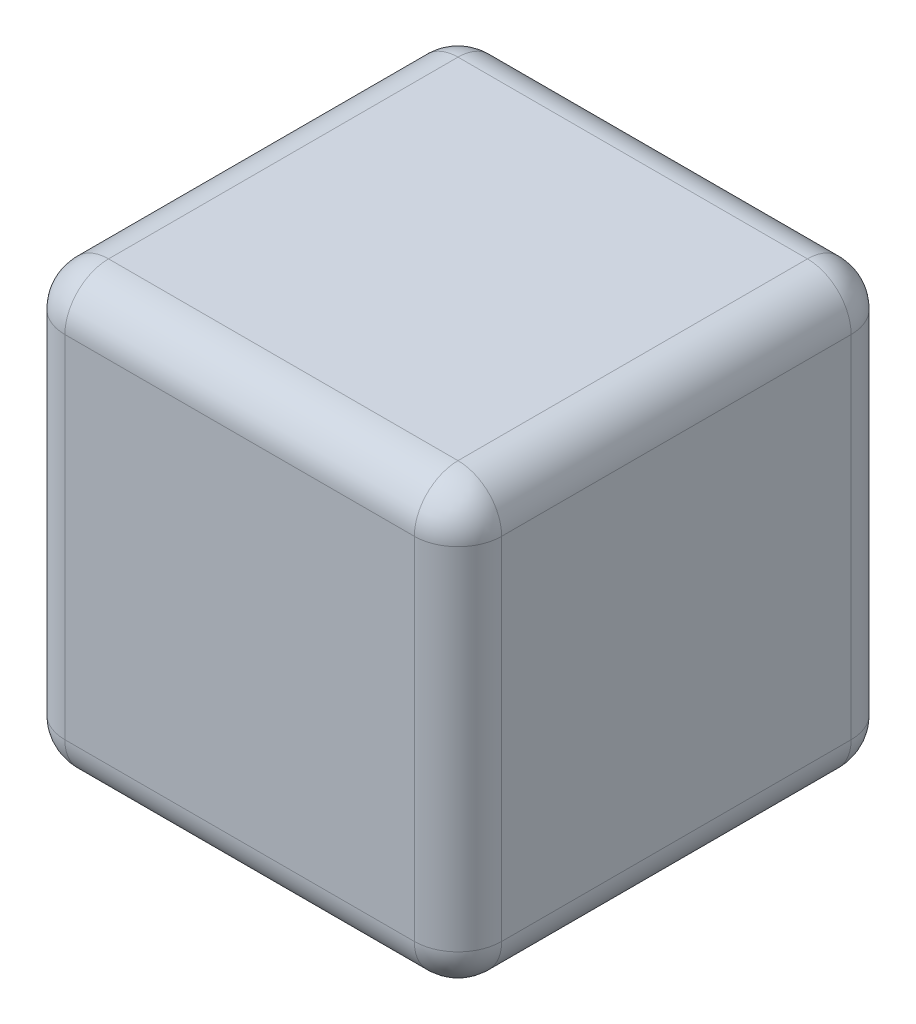
ISO-10303-21;
HEADER;
FILE_DESCRIPTION(('STEP AP214'),'2;1');
FILE_NAME('part.step','',(''),(''),'','','');
FILE_SCHEMA(('AUTOMOTIVE_DESIGN { 1 0 10303 214 1 1 1 1 }'));
ENDSEC;
DATA;
#1=APPLICATION_CONTEXT('core data for automotive mechanical design processes');
#2=APPLICATION_PROTOCOL_DEFINITION('international standard','automotive_design',2000,#1);
#3=PRODUCT_CONTEXT('',#1,'mechanical');
#4=PRODUCT('Part','Part','',(#3));
#5=PRODUCT_RELATED_PRODUCT_CATEGORY('part','',(#4));
#6=PRODUCT_DEFINITION_FORMATION('','',#4);
#7=PRODUCT_DEFINITION_CONTEXT('part definition',#1,'design');
#8=PRODUCT_DEFINITION('design','',#6,#7);
#9=PRODUCT_DEFINITION_SHAPE('','',#8);
#10=(LENGTH_UNIT() NAMED_UNIT(*) SI_UNIT(.MILLI.,.METRE.));
#11=(NAMED_UNIT(*) PLANE_ANGLE_UNIT() SI_UNIT($,.RADIAN.));
#12=(NAMED_UNIT(*) SI_UNIT($,.STERADIAN.) SOLID_ANGLE_UNIT());
#13=UNCERTAINTY_MEASURE_WITH_UNIT(LENGTH_MEASURE(1.E-05),#10,'distance_accuracy_value','');
#14=(GEOMETRIC_REPRESENTATION_CONTEXT(3) GLOBAL_UNCERTAINTY_ASSIGNED_CONTEXT((#13)) GLOBAL_UNIT_ASSIGNED_CONTEXT((#10,
#11,#12)) REPRESENTATION_CONTEXT('',''));
#15=CARTESIAN_POINT('',(0.,0.,0.));
#16=DIRECTION('',(0.,0.,1.));
#17=DIRECTION('',(1.,0.,0.));
#18=AXIS2_PLACEMENT_3D('',#15,#16,#17);
#19=CARTESIAN_POINT('',(0.,20.066,0.));
#20=DIRECTION('',(0.,0.,1.));
#21=DIRECTION('',(1.,0.,0.));
#22=AXIS2_PLACEMENT_3D('',#19,#20,#21);
#23=PLANE('',#22);
#24=DIRECTION('',(0.,-1.,0.));
#25=VECTOR('',#24,1.);
#26=CARTESIAN_POINT('',(-18.,20.066,0.));
#27=LINE('',#26,#25);
#28=CARTESIAN_POINT('',(-18.,18.066,0.));
#29=VERTEX_POINT('',#28);
#30=CARTESIAN_POINT('',(-18.,2.,0.));
#31=VERTEX_POINT('',#30);
#32=EDGE_CURVE('E178',#29,#31,#27,.T.);
#33=ORIENTED_EDGE('',*,*,#32,.T.);
#34=DIRECTION('',(-1.,0.,0.));
#35=VECTOR('',#34,1.);
#36=CARTESIAN_POINT('',(0.,2.,0.));
#37=LINE('',#36,#35);
#38=CARTESIAN_POINT('',(-2.,2.,0.));
#39=VERTEX_POINT('',#38);
#40=EDGE_CURVE('E190',#31,#39,#37,.F.);
#41=ORIENTED_EDGE('',*,*,#40,.T.);
#42=DIRECTION('',(0.,-1.,0.));
#43=VECTOR('',#42,1.);
#44=CARTESIAN_POINT('',(-2.,20.066,0.));
#45=LINE('',#44,#43);
#46=CARTESIAN_POINT('',(-2.,18.066,0.));
#47=VERTEX_POINT('',#46);
#48=EDGE_CURVE('E145',#39,#47,#45,.F.);
#49=ORIENTED_EDGE('',*,*,#48,.T.);
#50=DIRECTION('',(-1.,0.,0.));
#51=VECTOR('',#50,1.);
#52=CARTESIAN_POINT('',(-20.,18.066,0.));
#53=LINE('',#52,#51);
#54=EDGE_CURVE('E174',#47,#29,#53,.T.);
#55=ORIENTED_EDGE('',*,*,#54,.T.);
#56=EDGE_LOOP('',(#33,#41,#49,#55));
#57=FACE_BOUND('',#56,.T.);
#58=ADVANCED_FACE('F44',(#57),#23,.T.);
#59=CARTESIAN_POINT('',(0.,20.066,0.));
#60=DIRECTION('',(-1.,0.,0.));
#61=DIRECTION('',(0.,0.,1.));
#62=AXIS2_PLACEMENT_3D('',#59,#60,#61);
#63=PLANE('',#62);
#64=DIRECTION('',(0.,0.,-1.));
#65=VECTOR('',#64,1.);
#66=CARTESIAN_POINT('',(0.,18.066,0.));
#67=LINE('',#66,#65);
#68=CARTESIAN_POINT('',(0.,18.066,-17.999999878));
#69=VERTEX_POINT('',#68);
#70=CARTESIAN_POINT('',(0.,18.066,-2.));
#71=VERTEX_POINT('',#70);
#72=EDGE_CURVE('E173',#69,#71,#67,.F.);
#73=ORIENTED_EDGE('',*,*,#72,.T.);
#74=DIRECTION('',(0.,-1.,0.));
#75=VECTOR('',#74,1.);
#76=CARTESIAN_POINT('',(0.,0.,-2.));
#77=LINE('',#76,#75);
#78=CARTESIAN_POINT('',(0.,2.,-2.));
#79=VERTEX_POINT('',#78);
#80=EDGE_CURVE('E139',#71,#79,#77,.T.);
#81=ORIENTED_EDGE('',*,*,#80,.T.);
#82=DIRECTION('',(0.,0.,-1.));
#83=VECTOR('',#82,1.);
#84=CARTESIAN_POINT('',(0.,2.,-19.999999878));
#85=LINE('',#84,#83);
#86=CARTESIAN_POINT('',(0.,2.,-17.999999878));
#87=VERTEX_POINT('',#86);
#88=EDGE_CURVE('E158',#79,#87,#85,.T.);
#89=ORIENTED_EDGE('',*,*,#88,.T.);
#90=DIRECTION('',(0.,-1.,0.));
#91=VECTOR('',#90,1.);
#92=CARTESIAN_POINT('',(0.,20.066,-17.999999878));
#93=LINE('',#92,#91);
#94=EDGE_CURVE('E167',#87,#69,#93,.F.);
#95=ORIENTED_EDGE('',*,*,#94,.T.);
#96=EDGE_LOOP('',(#73,#81,#89,#95));
#97=FACE_BOUND('',#96,.T.);
#98=ADVANCED_FACE('F170',(#97),#63,.F.);
#99=CARTESIAN_POINT('',(0.,20.066,-19.999999878));
#100=DIRECTION('',(0.,0.,1.));
#101=DIRECTION('',(1.,0.,0.));
#102=AXIS2_PLACEMENT_3D('',#99,#100,#101);
#103=PLANE('',#102);
#104=DIRECTION('',(0.,-1.,0.));
#105=VECTOR('',#104,1.);
#106=CARTESIAN_POINT('',(-2.,20.066,-19.999999878));
#107=LINE('',#106,#105);
#108=CARTESIAN_POINT('',(-2.,18.066,-19.999999878));
#109=VERTEX_POINT('',#108);
#110=CARTESIAN_POINT('',(-2.,2.,-19.999999878));
#111=VERTEX_POINT('',#110);
#112=EDGE_CURVE('E209',#109,#111,#107,.T.);
#113=ORIENTED_EDGE('',*,*,#112,.T.);
#114=DIRECTION('',(-1.,0.,0.));
#115=VECTOR('',#114,1.);
#116=CARTESIAN_POINT('',(-20.,2.,-19.999999878));
#117=LINE('',#116,#115);
#118=CARTESIAN_POINT('',(-18.,2.,-19.999999878));
#119=VERTEX_POINT('',#118);
#120=EDGE_CURVE('E211',#111,#119,#117,.T.);
#121=ORIENTED_EDGE('',*,*,#120,.T.);
#122=DIRECTION('',(0.,-1.,0.));
#123=VECTOR('',#122,1.);
#124=CARTESIAN_POINT('',(-18.,20.066,-19.999999878));
#125=LINE('',#124,#123);
#126=CARTESIAN_POINT('',(-18.,18.066,-19.999999878));
#127=VERTEX_POINT('',#126);
#128=EDGE_CURVE('E207',#119,#127,#125,.F.);
#129=ORIENTED_EDGE('',*,*,#128,.T.);
#130=DIRECTION('',(-1.,0.,0.));
#131=VECTOR('',#130,1.);
#132=CARTESIAN_POINT('',(0.,18.066,-19.999999878));
#133=LINE('',#132,#131);
#134=EDGE_CURVE('E201',#127,#109,#133,.F.);
#135=ORIENTED_EDGE('',*,*,#134,.T.);
#136=EDGE_LOOP('',(#113,#121,#129,#135));
#137=FACE_BOUND('',#136,.T.);
#138=ADVANCED_FACE('F338',(#137),#103,.F.);
#139=CARTESIAN_POINT('',(-20.,20.066,0.));
#140=DIRECTION('',(-1.,0.,0.));
#141=DIRECTION('',(0.,0.,1.));
#142=AXIS2_PLACEMENT_3D('',#139,#140,#141);
#143=PLANE('',#142);
#144=DIRECTION('',(0.,-1.,0.));
#145=VECTOR('',#144,1.);
#146=CARTESIAN_POINT('',(-20.,0.,-17.999999878));
#147=LINE('',#146,#145);
#148=CARTESIAN_POINT('',(-20.,18.066,-17.999999878));
#149=VERTEX_POINT('',#148);
#150=CARTESIAN_POINT('',(-20.,2.,-17.999999878));
#151=VERTEX_POINT('',#150);
#152=EDGE_CURVE('E54',#149,#151,#147,.T.);
#153=ORIENTED_EDGE('',*,*,#152,.T.);
#154=DIRECTION('',(0.,0.,-1.));
#155=VECTOR('',#154,1.);
#156=CARTESIAN_POINT('',(-20.,2.,0.));
#157=LINE('',#156,#155);
#158=CARTESIAN_POINT('',(-20.,2.,-2.));
#159=VERTEX_POINT('',#158);
#160=EDGE_CURVE('E11',#151,#159,#157,.F.);
#161=ORIENTED_EDGE('',*,*,#160,.T.);
#162=DIRECTION('',(0.,-1.,0.));
#163=VECTOR('',#162,1.);
#164=CARTESIAN_POINT('',(-20.,20.066,-2.));
#165=LINE('',#164,#163);
#166=CARTESIAN_POINT('',(-20.,18.066,-2.));
#167=VERTEX_POINT('',#166);
#168=EDGE_CURVE('E235',#159,#167,#165,.F.);
#169=ORIENTED_EDGE('',*,*,#168,.T.);
#170=DIRECTION('',(0.,0.,-1.));
#171=VECTOR('',#170,1.);
#172=CARTESIAN_POINT('',(-20.,18.066,-19.999999878));
#173=LINE('',#172,#171);
#174=EDGE_CURVE('E227',#167,#149,#173,.T.);
#175=ORIENTED_EDGE('',*,*,#174,.T.);
#176=EDGE_LOOP('',(#153,#161,#169,#175));
#177=FACE_BOUND('',#176,.T.);
#178=ADVANCED_FACE('F355',(#177),#143,.T.);
#179=CARTESIAN_POINT('',(0.,20.066,0.));
#180=DIRECTION('',(0.,-1.,0.));
#181=DIRECTION('',(0.,0.,-1.));
#182=AXIS2_PLACEMENT_3D('',#179,#180,#181);
#183=PLANE('',#182);
#184=DIRECTION('',(0.,0.,-1.));
#185=VECTOR('',#184,1.);
#186=CARTESIAN_POINT('',(-2.,20.066,0.));
#187=LINE('',#186,#185);
#188=CARTESIAN_POINT('',(-2.,20.066,-2.));
#189=VERTEX_POINT('',#188);
#190=CARTESIAN_POINT('',(-2.,20.066,-17.999999878));
#191=VERTEX_POINT('',#190);
#192=EDGE_CURVE('E197',#189,#191,#187,.T.);
#193=ORIENTED_EDGE('',*,*,#192,.T.);
#194=DIRECTION('',(-1.,0.,0.));
#195=VECTOR('',#194,1.);
#196=CARTESIAN_POINT('',(0.,20.066,-17.999999878));
#197=LINE('',#196,#195);
#198=CARTESIAN_POINT('',(-18.,20.066,-17.999999878));
#199=VERTEX_POINT('',#198);
#200=EDGE_CURVE('E196',#191,#199,#197,.T.);
#201=ORIENTED_EDGE('',*,*,#200,.T.);
#202=DIRECTION('',(0.,0.,-1.));
#203=VECTOR('',#202,1.);
#204=CARTESIAN_POINT('',(-18.,20.066,0.));
#205=LINE('',#204,#203);
#206=CARTESIAN_POINT('',(-18.,20.066,-2.));
#207=VERTEX_POINT('',#206);
#208=EDGE_CURVE('E194',#199,#207,#205,.F.);
#209=ORIENTED_EDGE('',*,*,#208,.T.);
#210=DIRECTION('',(-1.,0.,0.));
#211=VECTOR('',#210,1.);
#212=CARTESIAN_POINT('',(0.,20.066,-2.));
#213=LINE('',#212,#211);
#214=EDGE_CURVE('E189',#207,#189,#213,.F.);
#215=ORIENTED_EDGE('',*,*,#214,.T.);
#216=EDGE_LOOP('',(#193,#201,#209,#215));
#217=FACE_BOUND('',#216,.T.);
#218=ADVANCED_FACE('F332',(#217),#183,.F.);
#219=CARTESIAN_POINT('',(0.,0.,0.));
#220=DIRECTION('',(0.,-1.,0.));
#221=DIRECTION('',(0.,0.,-1.));
#222=AXIS2_PLACEMENT_3D('',#219,#220,#221);
#223=PLANE('',#222);
#224=DIRECTION('',(-1.,0.,0.));
#225=VECTOR('',#224,1.);
#226=CARTESIAN_POINT('',(0.,0.,-17.999999878));
#227=LINE('',#226,#225);
#228=CARTESIAN_POINT('',(-18.,0.,-17.999999878));
#229=VERTEX_POINT('',#228);
#230=CARTESIAN_POINT('',(-2.,0.,-17.999999878));
#231=VERTEX_POINT('',#230);
#232=EDGE_CURVE('E225',#229,#231,#227,.F.);
#233=ORIENTED_EDGE('',*,*,#232,.T.);
#234=DIRECTION('',(0.,0.,-1.));
#235=VECTOR('',#234,1.);
#236=CARTESIAN_POINT('',(-2.,0.,0.));
#237=LINE('',#236,#235);
#238=CARTESIAN_POINT('',(-2.,0.,-2.));
#239=VERTEX_POINT('',#238);
#240=EDGE_CURVE('E224',#231,#239,#237,.F.);
#241=ORIENTED_EDGE('',*,*,#240,.T.);
#242=DIRECTION('',(-1.,0.,0.));
#243=VECTOR('',#242,1.);
#244=CARTESIAN_POINT('',(0.,0.,-2.));
#245=LINE('',#244,#243);
#246=CARTESIAN_POINT('',(-18.,0.,-2.));
#247=VERTEX_POINT('',#246);
#248=EDGE_CURVE('E218',#239,#247,#245,.T.);
#249=ORIENTED_EDGE('',*,*,#248,.T.);
#250=DIRECTION('',(0.,0.,-1.));
#251=VECTOR('',#250,1.);
#252=CARTESIAN_POINT('',(-18.,0.,0.));
#253=LINE('',#252,#251);
#254=EDGE_CURVE('E219',#247,#229,#253,.T.);
#255=ORIENTED_EDGE('',*,*,#254,.T.);
#256=EDGE_LOOP('',(#233,#241,#249,#255));
#257=FACE_BOUND('',#256,.T.);
#258=ADVANCED_FACE('F536',(#257),#223,.T.);
#259=CARTESIAN_POINT('',(-18.,20.066,-17.999999878));
#260=DIRECTION('',(0.,1.,0.));
#261=DIRECTION('',(0.,0.,1.));
#262=AXIS2_PLACEMENT_3D('',#259,#260,#261);
#263=CYLINDRICAL_SURFACE('',#262,2.);
#264=CARTESIAN_POINT('',(-18.,18.066,-17.999999878));
#265=DIRECTION('',(0.,1.,0.));
#266=DIRECTION('',(0.,0.,1.));
#267=AXIS2_PLACEMENT_3D('',#264,#265,#266);
#268=CIRCLE('',#267,2.);
#269=EDGE_CURVE('E47',#127,#149,#268,.T.);
#270=ORIENTED_EDGE('',*,*,#269,.F.);
#271=ORIENTED_EDGE('',*,*,#128,.F.);
#272=CARTESIAN_POINT('',(-18.,2.,-17.999999878));
#273=DIRECTION('',(0.,-1.,0.));
#274=DIRECTION('',(0.,0.,-1.));
#275=AXIS2_PLACEMENT_3D('',#272,#273,#274);
#276=CIRCLE('',#275,2.);
#277=EDGE_CURVE('E308',#151,#119,#276,.T.);
#278=ORIENTED_EDGE('',*,*,#277,.F.);
#279=ORIENTED_EDGE('',*,*,#152,.F.);
#280=EDGE_LOOP('',(#270,#271,#278,#279));
#281=FACE_BOUND('',#280,.T.);
#282=ADVANCED_FACE('F50',(#281),#263,.T.);
#283=CARTESIAN_POINT('',(-18.,18.066,-17.999999878));
#284=DIRECTION('',(-1.,0.,0.));
#285=DIRECTION('',(0.,0.,1.));
#286=AXIS2_PLACEMENT_3D('',#283,#284,#285);
#287=SPHERICAL_SURFACE('',#286,2.);
#288=CARTESIAN_POINT('',(-18.,18.066,-17.999999878));
#289=DIRECTION('',(-1.,0.,0.));
#290=DIRECTION('',(0.,0.,1.));
#291=AXIS2_PLACEMENT_3D('',#288,#289,#290);
#292=CIRCLE('',#291,2.);
#293=EDGE_CURVE('E299',#127,#199,#292,.F.);
#294=ORIENTED_EDGE('',*,*,#293,.F.);
#295=ORIENTED_EDGE('',*,*,#269,.T.);
#296=CARTESIAN_POINT('',(-18.,18.066,-17.999999878));
#297=DIRECTION('',(0.,0.,-1.));
#298=DIRECTION('',(-1.,0.,0.));
#299=AXIS2_PLACEMENT_3D('',#296,#297,#298);
#300=CIRCLE('',#299,2.);
#301=EDGE_CURVE('E301',#199,#149,#300,.F.);
#302=ORIENTED_EDGE('',*,*,#301,.F.);
#303=EDGE_LOOP('',(#294,#295,#302));
#304=FACE_BOUND('',#303,.T.);
#305=ADVANCED_FACE('F318',(#304),#287,.T.);
#306=CARTESIAN_POINT('',(-18.,2.,-17.999999878));
#307=DIRECTION('',(0.,0.,-1.));
#308=DIRECTION('',(0.,1.,0.));
#309=AXIS2_PLACEMENT_3D('',#306,#307,#308);
#310=SPHERICAL_SURFACE('',#309,2.);
#311=CARTESIAN_POINT('',(-18.,2.,-17.999999878));
#312=DIRECTION('',(0.,0.,-1.));
#313=DIRECTION('',(-1.,0.,0.));
#314=AXIS2_PLACEMENT_3D('',#311,#312,#313);
#315=CIRCLE('',#314,2.);
#316=EDGE_CURVE('E295',#151,#229,#315,.F.);
#317=ORIENTED_EDGE('',*,*,#316,.F.);
#318=ORIENTED_EDGE('',*,*,#277,.T.);
#319=CARTESIAN_POINT('',(-18.,2.,-17.999999878));
#320=DIRECTION('',(-1.,0.,0.));
#321=DIRECTION('',(0.,0.,1.));
#322=AXIS2_PLACEMENT_3D('',#319,#320,#321);
#323=CIRCLE('',#322,2.);
#324=EDGE_CURVE('E293',#229,#119,#323,.F.);
#325=ORIENTED_EDGE('',*,*,#324,.F.);
#326=EDGE_LOOP('',(#317,#318,#325));
#327=FACE_BOUND('',#326,.T.);
#328=ADVANCED_FACE('F511',(#327),#310,.T.);
#329=CARTESIAN_POINT('',(-18.,18.066,0.));
#330=DIRECTION('',(0.,0.,1.));
#331=DIRECTION('',(1.,0.,0.));
#332=AXIS2_PLACEMENT_3D('',#329,#330,#331);
#333=CYLINDRICAL_SURFACE('',#332,2.);
#334=ORIENTED_EDGE('',*,*,#301,.T.);
#335=ORIENTED_EDGE('',*,*,#174,.F.);
#336=CARTESIAN_POINT('',(-18.,18.066,-2.));
#337=DIRECTION('',(0.,0.,1.));
#338=DIRECTION('',(1.,0.,0.));
#339=AXIS2_PLACEMENT_3D('',#336,#337,#338);
#340=CIRCLE('',#339,2.);
#341=EDGE_CURVE('E281',#207,#167,#340,.T.);
#342=ORIENTED_EDGE('',*,*,#341,.F.);
#343=ORIENTED_EDGE('',*,*,#208,.F.);
#344=EDGE_LOOP('',(#334,#335,#342,#343));
#345=FACE_BOUND('',#344,.T.);
#346=ADVANCED_FACE('F327',(#345),#333,.T.);
#347=CARTESIAN_POINT('',(0.,18.066,-17.999999878));
#348=DIRECTION('',(-1.,0.,0.));
#349=DIRECTION('',(0.,0.,1.));
#350=AXIS2_PLACEMENT_3D('',#347,#348,#349);
#351=CYLINDRICAL_SURFACE('',#350,2.);
#352=ORIENTED_EDGE('',*,*,#293,.T.);
#353=ORIENTED_EDGE('',*,*,#200,.F.);
#354=CARTESIAN_POINT('',(-2.,18.066,-17.999999878));
#355=DIRECTION('',(1.,0.,0.));
#356=DIRECTION('',(0.,0.,-1.));
#357=AXIS2_PLACEMENT_3D('',#354,#355,#356);
#358=CIRCLE('',#357,2.);
#359=EDGE_CURVE('E279',#109,#191,#358,.T.);
#360=ORIENTED_EDGE('',*,*,#359,.F.);
#361=ORIENTED_EDGE('',*,*,#134,.F.);
#362=EDGE_LOOP('',(#352,#353,#360,#361));
#363=FACE_BOUND('',#362,.T.);
#364=ADVANCED_FACE('F340',(#363),#351,.T.);
#365=CARTESIAN_POINT('',(-2.,20.066,-17.999999878));
#366=DIRECTION('',(0.,-1.,0.));
#367=DIRECTION('',(0.,0.,-1.));
#368=AXIS2_PLACEMENT_3D('',#365,#366,#367);
#369=CYLINDRICAL_SURFACE('',#368,2.);
#370=CARTESIAN_POINT('',(-2.,2.,-17.999999878));
#371=DIRECTION('',(0.,-1.,0.));
#372=DIRECTION('',(0.,0.,-1.));
#373=AXIS2_PLACEMENT_3D('',#370,#371,#372);
#374=CIRCLE('',#373,2.);
#375=EDGE_CURVE('E275',#111,#87,#374,.T.);
#376=ORIENTED_EDGE('',*,*,#375,.F.);
#377=ORIENTED_EDGE('',*,*,#112,.F.);
#378=CARTESIAN_POINT('',(-2.,18.066,-17.999999878));
#379=DIRECTION('',(0.,1.,0.));
#380=DIRECTION('',(0.,0.,1.));
#381=AXIS2_PLACEMENT_3D('',#378,#379,#380);
#382=CIRCLE('',#381,2.);
#383=EDGE_CURVE('E276',#69,#109,#382,.T.);
#384=ORIENTED_EDGE('',*,*,#383,.F.);
#385=ORIENTED_EDGE('',*,*,#94,.F.);
#386=EDGE_LOOP('',(#376,#377,#384,#385));
#387=FACE_BOUND('',#386,.T.);
#388=ADVANCED_FACE('F344',(#387),#369,.T.);
#389=CARTESIAN_POINT('',(0.,2.,-17.999999878));
#390=DIRECTION('',(1.,0.,0.));
#391=DIRECTION('',(0.,0.,-1.));
#392=AXIS2_PLACEMENT_3D('',#389,#390,#391);
#393=CYLINDRICAL_SURFACE('',#392,2.);
#394=ORIENTED_EDGE('',*,*,#324,.T.);
#395=ORIENTED_EDGE('',*,*,#120,.F.);
#396=CARTESIAN_POINT('',(-2.,2.,-17.999999878));
#397=DIRECTION('',(1.,0.,0.));
#398=DIRECTION('',(0.,0.,-1.));
#399=AXIS2_PLACEMENT_3D('',#396,#397,#398);
#400=CIRCLE('',#399,2.);
#401=EDGE_CURVE('E267',#231,#111,#400,.T.);
#402=ORIENTED_EDGE('',*,*,#401,.F.);
#403=ORIENTED_EDGE('',*,*,#232,.F.);
#404=EDGE_LOOP('',(#394,#395,#402,#403));
#405=FACE_BOUND('',#404,.T.);
#406=ADVANCED_FACE('F349',(#405),#393,.T.);
#407=CARTESIAN_POINT('',(-18.,2.,0.));
#408=DIRECTION('',(0.,0.,-1.));
#409=DIRECTION('',(-1.,0.,0.));
#410=AXIS2_PLACEMENT_3D('',#407,#408,#409);
#411=CYLINDRICAL_SURFACE('',#410,2.);
#412=ORIENTED_EDGE('',*,*,#316,.T.);
#413=ORIENTED_EDGE('',*,*,#254,.F.);
#414=CARTESIAN_POINT('',(-18.,2.,-2.));
#415=DIRECTION('',(0.,0.,1.));
#416=DIRECTION('',(1.,0.,0.));
#417=AXIS2_PLACEMENT_3D('',#414,#415,#416);
#418=CIRCLE('',#417,2.);
#419=EDGE_CURVE('E262',#159,#247,#418,.T.);
#420=ORIENTED_EDGE('',*,*,#419,.F.);
#421=ORIENTED_EDGE('',*,*,#160,.F.);
#422=EDGE_LOOP('',(#412,#413,#420,#421));
#423=FACE_BOUND('',#422,.T.);
#424=ADVANCED_FACE('F357',(#423),#411,.T.);
#425=CARTESIAN_POINT('',(-18.,20.066,-2.));
#426=DIRECTION('',(0.,-1.,0.));
#427=DIRECTION('',(0.,0.,-1.));
#428=AXIS2_PLACEMENT_3D('',#425,#426,#427);
#429=CYLINDRICAL_SURFACE('',#428,2.);
#430=CARTESIAN_POINT('',(-18.,18.066,-2.));
#431=DIRECTION('',(0.,1.,0.));
#432=DIRECTION('',(0.,0.,1.));
#433=AXIS2_PLACEMENT_3D('',#430,#431,#432);
#434=CIRCLE('',#433,2.);
#435=EDGE_CURVE('E288',#167,#29,#434,.T.);
#436=ORIENTED_EDGE('',*,*,#435,.F.);
#437=ORIENTED_EDGE('',*,*,#168,.F.);
#438=CARTESIAN_POINT('',(-18.,2.,-2.));
#439=DIRECTION('',(0.,-1.,0.));
#440=DIRECTION('',(0.,0.,-1.));
#441=AXIS2_PLACEMENT_3D('',#438,#439,#440);
#442=CIRCLE('',#441,2.);
#443=EDGE_CURVE('E263',#31,#159,#442,.T.);
#444=ORIENTED_EDGE('',*,*,#443,.F.);
#445=ORIENTED_EDGE('',*,*,#32,.F.);
#446=EDGE_LOOP('',(#436,#437,#444,#445));
#447=FACE_BOUND('',#446,.T.);
#448=ADVANCED_FACE('F352',(#447),#429,.T.);
#449=CARTESIAN_POINT('',(-18.,18.066,-2.));
#450=DIRECTION('',(-1.,0.,0.));
#451=DIRECTION('',(0.,0.,1.));
#452=AXIS2_PLACEMENT_3D('',#449,#450,#451);
#453=SPHERICAL_SURFACE('',#452,2.);
#454=ORIENTED_EDGE('',*,*,#341,.T.);
#455=ORIENTED_EDGE('',*,*,#435,.T.);
#456=CARTESIAN_POINT('',(-18.,18.066,-2.));
#457=DIRECTION('',(-1.,0.,0.));
#458=DIRECTION('',(0.,0.,1.));
#459=AXIS2_PLACEMENT_3D('',#456,#457,#458);
#460=CIRCLE('',#459,2.);
#461=EDGE_CURVE('E257',#207,#29,#460,.F.);
#462=ORIENTED_EDGE('',*,*,#461,.F.);
#463=EDGE_LOOP('',(#454,#455,#462));
#464=FACE_BOUND('',#463,.T.);
#465=ADVANCED_FACE('F367',(#464),#453,.T.);
#466=CARTESIAN_POINT('',(-2.,18.066,-17.999999878));
#467=DIRECTION('',(0.,0.,-1.));
#468=DIRECTION('',(-1.,0.,0.));
#469=AXIS2_PLACEMENT_3D('',#466,#467,#468);
#470=SPHERICAL_SURFACE('',#469,2.);
#471=ORIENTED_EDGE('',*,*,#383,.T.);
#472=ORIENTED_EDGE('',*,*,#359,.T.);
#473=CARTESIAN_POINT('',(-2.,18.066,-17.999999878));
#474=DIRECTION('',(0.,0.,-1.));
#475=DIRECTION('',(-1.,0.,0.));
#476=AXIS2_PLACEMENT_3D('',#473,#474,#475);
#477=CIRCLE('',#476,2.);
#478=EDGE_CURVE('E254',#69,#191,#477,.F.);
#479=ORIENTED_EDGE('',*,*,#478,.F.);
#480=EDGE_LOOP('',(#471,#472,#479));
#481=FACE_BOUND('',#480,.T.);
#482=ADVANCED_FACE('F378',(#481),#470,.T.);
#483=CARTESIAN_POINT('',(-2.,2.,-17.999999878));
#484=DIRECTION('',(0.,0.,-1.));
#485=DIRECTION('',(0.,1.,0.));
#486=AXIS2_PLACEMENT_3D('',#483,#484,#485);
#487=SPHERICAL_SURFACE('',#486,2.);
#488=ORIENTED_EDGE('',*,*,#401,.T.);
#489=ORIENTED_EDGE('',*,*,#375,.T.);
#490=CARTESIAN_POINT('',(-2.,2.,-17.999999878));
#491=DIRECTION('',(0.,0.,-1.));
#492=DIRECTION('',(-1.,0.,0.));
#493=AXIS2_PLACEMENT_3D('',#490,#491,#492);
#494=CIRCLE('',#493,2.);
#495=EDGE_CURVE('E163',#231,#87,#494,.F.);
#496=ORIENTED_EDGE('',*,*,#495,.F.);
#497=EDGE_LOOP('',(#488,#489,#496));
#498=FACE_BOUND('',#497,.T.);
#499=ADVANCED_FACE('F376',(#498),#487,.T.);
#500=CARTESIAN_POINT('',(-18.,2.,-2.));
#501=DIRECTION('',(-1.,0.,0.));
#502=DIRECTION('',(0.,0.,1.));
#503=AXIS2_PLACEMENT_3D('',#500,#501,#502);
#504=SPHERICAL_SURFACE('',#503,2.);
#505=ORIENTED_EDGE('',*,*,#443,.T.);
#506=ORIENTED_EDGE('',*,*,#419,.T.);
#507=CARTESIAN_POINT('',(-18.,2.,-2.));
#508=DIRECTION('',(-1.,0.,0.));
#509=DIRECTION('',(0.,0.,1.));
#510=AXIS2_PLACEMENT_3D('',#507,#508,#509);
#511=CIRCLE('',#510,2.);
#512=EDGE_CURVE('E246',#31,#247,#511,.F.);
#513=ORIENTED_EDGE('',*,*,#512,.F.);
#514=EDGE_LOOP('',(#505,#506,#513));
#515=FACE_BOUND('',#514,.T.);
#516=ADVANCED_FACE('F361',(#515),#504,.T.);
#517=CARTESIAN_POINT('',(0.,18.066,-2.));
#518=DIRECTION('',(1.,0.,0.));
#519=DIRECTION('',(0.,0.,-1.));
#520=AXIS2_PLACEMENT_3D('',#517,#518,#519);
#521=CYLINDRICAL_SURFACE('',#520,2.);
#522=ORIENTED_EDGE('',*,*,#461,.T.);
#523=ORIENTED_EDGE('',*,*,#54,.F.);
#524=CARTESIAN_POINT('',(-2.,18.066,-2.));
#525=DIRECTION('',(1.,0.,0.));
#526=DIRECTION('',(0.,0.,-1.));
#527=AXIS2_PLACEMENT_3D('',#524,#525,#526);
#528=CIRCLE('',#527,2.);
#529=EDGE_CURVE('E244',#189,#47,#528,.T.);
#530=ORIENTED_EDGE('',*,*,#529,.F.);
#531=ORIENTED_EDGE('',*,*,#214,.F.);
#532=EDGE_LOOP('',(#522,#523,#530,#531));
#533=FACE_BOUND('',#532,.T.);
#534=ADVANCED_FACE('F369',(#533),#521,.T.);
#535=CARTESIAN_POINT('',(-2.,18.066,0.));
#536=DIRECTION('',(0.,0.,-1.));
#537=DIRECTION('',(-1.,0.,0.));
#538=AXIS2_PLACEMENT_3D('',#535,#536,#537);
#539=CYLINDRICAL_SURFACE('',#538,2.);
#540=ORIENTED_EDGE('',*,*,#478,.T.);
#541=ORIENTED_EDGE('',*,*,#192,.F.);
#542=CARTESIAN_POINT('',(-2.,18.066,-2.));
#543=DIRECTION('',(0.,0.,1.));
#544=DIRECTION('',(1.,0.,0.));
#545=AXIS2_PLACEMENT_3D('',#542,#543,#544);
#546=CIRCLE('',#545,2.);
#547=EDGE_CURVE('E160',#71,#189,#546,.T.);
#548=ORIENTED_EDGE('',*,*,#547,.F.);
#549=ORIENTED_EDGE('',*,*,#72,.F.);
#550=EDGE_LOOP('',(#540,#541,#548,#549));
#551=FACE_BOUND('',#550,.T.);
#552=ADVANCED_FACE('F377',(#551),#539,.T.);
#553=CARTESIAN_POINT('',(-2.,2.,0.));
#554=DIRECTION('',(0.,0.,1.));
#555=DIRECTION('',(1.,0.,0.));
#556=AXIS2_PLACEMENT_3D('',#553,#554,#555);
#557=CYLINDRICAL_SURFACE('',#556,2.);
#558=ORIENTED_EDGE('',*,*,#495,.T.);
#559=ORIENTED_EDGE('',*,*,#88,.F.);
#560=CARTESIAN_POINT('',(-2.,2.,-2.));
#561=DIRECTION('',(0.,0.,1.));
#562=DIRECTION('',(1.,0.,0.));
#563=AXIS2_PLACEMENT_3D('',#560,#561,#562);
#564=CIRCLE('',#563,2.);
#565=EDGE_CURVE('E149',#239,#79,#564,.T.);
#566=ORIENTED_EDGE('',*,*,#565,.F.);
#567=ORIENTED_EDGE('',*,*,#240,.F.);
#568=EDGE_LOOP('',(#558,#559,#566,#567));
#569=FACE_BOUND('',#568,.T.);
#570=ADVANCED_FACE('F162',(#569),#557,.T.);
#571=CARTESIAN_POINT('',(0.,2.,-2.));
#572=DIRECTION('',(-1.,0.,0.));
#573=DIRECTION('',(0.,0.,1.));
#574=AXIS2_PLACEMENT_3D('',#571,#572,#573);
#575=CYLINDRICAL_SURFACE('',#574,2.);
#576=ORIENTED_EDGE('',*,*,#512,.T.);
#577=ORIENTED_EDGE('',*,*,#248,.F.);
#578=CARTESIAN_POINT('',(-2.,2.,-2.));
#579=DIRECTION('',(1.,0.,0.));
#580=DIRECTION('',(0.,0.,-1.));
#581=AXIS2_PLACEMENT_3D('',#578,#579,#580);
#582=CIRCLE('',#581,2.);
#583=EDGE_CURVE('E155',#39,#239,#582,.T.);
#584=ORIENTED_EDGE('',*,*,#583,.F.);
#585=ORIENTED_EDGE('',*,*,#40,.F.);
#586=EDGE_LOOP('',(#576,#577,#584,#585));
#587=FACE_BOUND('',#586,.T.);
#588=ADVANCED_FACE('F362',(#587),#575,.T.);
#589=CARTESIAN_POINT('',(-2.,18.066,-2.));
#590=DIRECTION('',(0.,1.,0.));
#591=DIRECTION('',(0.,0.,1.));
#592=AXIS2_PLACEMENT_3D('',#589,#590,#591);
#593=SPHERICAL_SURFACE('',#592,2.);
#594=ORIENTED_EDGE('',*,*,#547,.T.);
#595=ORIENTED_EDGE('',*,*,#529,.T.);
#596=CARTESIAN_POINT('',(-2.,18.066,-2.));
#597=DIRECTION('',(0.,1.,0.));
#598=DIRECTION('',(0.,0.,1.));
#599=AXIS2_PLACEMENT_3D('',#596,#597,#598);
#600=CIRCLE('',#599,2.);
#601=EDGE_CURVE('E144',#71,#47,#600,.F.);
#602=ORIENTED_EDGE('',*,*,#601,.F.);
#603=EDGE_LOOP('',(#594,#595,#602));
#604=FACE_BOUND('',#603,.T.);
#605=ADVANCED_FACE('F371',(#604),#593,.T.);
#606=CARTESIAN_POINT('',(-2.,2.,-2.));
#607=DIRECTION('',(0.,-1.,0.));
#608=DIRECTION('',(0.,0.,-1.));
#609=AXIS2_PLACEMENT_3D('',#606,#607,#608);
#610=SPHERICAL_SURFACE('',#609,2.);
#611=ORIENTED_EDGE('',*,*,#583,.T.);
#612=ORIENTED_EDGE('',*,*,#565,.T.);
#613=CARTESIAN_POINT('',(-2.,2.,-2.));
#614=DIRECTION('',(0.,-1.,0.));
#615=DIRECTION('',(0.,0.,-1.));
#616=AXIS2_PLACEMENT_3D('',#613,#614,#615);
#617=CIRCLE('',#616,2.);
#618=EDGE_CURVE('E136',#39,#79,#617,.F.);
#619=ORIENTED_EDGE('',*,*,#618,.F.);
#620=EDGE_LOOP('',(#611,#612,#619));
#621=FACE_BOUND('',#620,.T.);
#622=ADVANCED_FACE('F148',(#621),#610,.T.);
#623=CARTESIAN_POINT('',(-2.,20.066,-2.));
#624=DIRECTION('',(0.,1.,0.));
#625=DIRECTION('',(0.,0.,1.));
#626=AXIS2_PLACEMENT_3D('',#623,#624,#625);
#627=CYLINDRICAL_SURFACE('',#626,2.);
#628=ORIENTED_EDGE('',*,*,#601,.T.);
#629=ORIENTED_EDGE('',*,*,#48,.F.);
#630=ORIENTED_EDGE('',*,*,#618,.T.);
#631=ORIENTED_EDGE('',*,*,#80,.F.);
#632=EDGE_LOOP('',(#628,#629,#630,#631));
#633=FACE_BOUND('',#632,.T.);
#634=ADVANCED_FACE('F138',(#633),#627,.T.);
#635=CLOSED_SHELL('',(#58,#98,#138,#178,#218,#258,#282,#305,#328,#346,#364,#388,#406,#424,#448,
#465,#482,#499,#516,#534,#552,#570,#588,#605,#622,#634));
#636=MANIFOLD_SOLID_BREP('B2',#635);
#637=ADVANCED_BREP_SHAPE_REPRESENTATION('',(#18,#636),#14);
#638=SHAPE_DEFINITION_REPRESENTATION(#9,#637);
ENDSEC;
END-ISO-10303-21;
